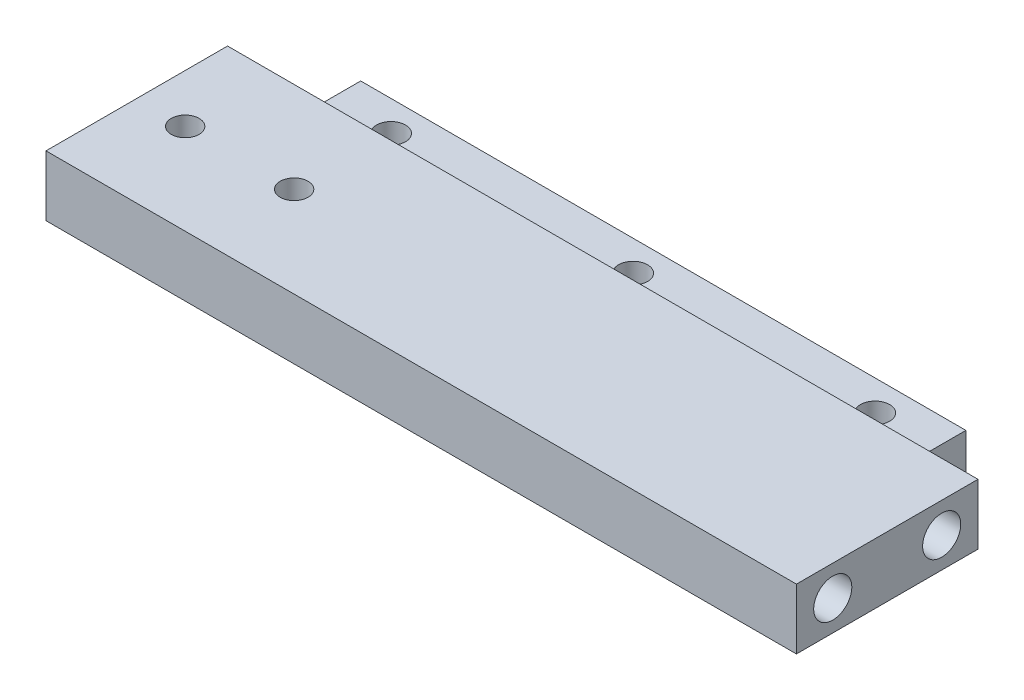
ISO-10303-21;
HEADER;
FILE_DESCRIPTION(('STEP AP214'),'2;1');
FILE_NAME('part.step','',(''),(''),'','','');
FILE_SCHEMA(('AUTOMOTIVE_DESIGN { 1 0 10303 214 1 1 1 1 }'));
ENDSEC;
DATA;
#1=APPLICATION_CONTEXT('core data for automotive mechanical design processes');
#2=APPLICATION_PROTOCOL_DEFINITION('international standard','automotive_design',2000,#1);
#3=PRODUCT_CONTEXT('',#1,'mechanical');
#4=PRODUCT('Part','Part','',(#3));
#5=PRODUCT_RELATED_PRODUCT_CATEGORY('part','',(#4));
#6=PRODUCT_DEFINITION_FORMATION('','',#4);
#7=PRODUCT_DEFINITION_CONTEXT('part definition',#1,'design');
#8=PRODUCT_DEFINITION('design','',#6,#7);
#9=PRODUCT_DEFINITION_SHAPE('','',#8);
#10=(LENGTH_UNIT() NAMED_UNIT(*) SI_UNIT(.MILLI.,.METRE.));
#11=(NAMED_UNIT(*) PLANE_ANGLE_UNIT() SI_UNIT($,.RADIAN.));
#12=(NAMED_UNIT(*) SI_UNIT($,.STERADIAN.) SOLID_ANGLE_UNIT());
#13=UNCERTAINTY_MEASURE_WITH_UNIT(LENGTH_MEASURE(1.E-05),#10,'distance_accuracy_value','');
#14=(GEOMETRIC_REPRESENTATION_CONTEXT(3) GLOBAL_UNCERTAINTY_ASSIGNED_CONTEXT((#13)) GLOBAL_UNIT_ASSIGNED_CONTEXT((#10,
#11,#12)) REPRESENTATION_CONTEXT('',''));
#15=CARTESIAN_POINT('',(0.,0.,0.));
#16=DIRECTION('',(0.,0.,1.));
#17=DIRECTION('',(1.,0.,0.));
#18=AXIS2_PLACEMENT_3D('',#15,#16,#17);
#19=CARTESIAN_POINT('',(0.,5.,-15.));
#20=DIRECTION('',(0.,0.,1.));
#21=DIRECTION('',(1.,0.,0.));
#22=AXIS2_PLACEMENT_3D('',#19,#20,#21);
#23=PLANE('',#22);
#24=DIRECTION('',(0.,1.,0.));
#25=VECTOR('',#24,1.);
#26=CARTESIAN_POINT('',(6.,3.,-15.));
#27=LINE('',#26,#25);
#28=CARTESIAN_POINT('',(6.,0.,-15.));
#29=VERTEX_POINT('',#28);
#30=CARTESIAN_POINT('',(6.,3.,-15.));
#31=VERTEX_POINT('',#30);
#32=EDGE_CURVE('E63',#29,#31,#27,.T.);
#33=ORIENTED_EDGE('',*,*,#32,.F.);
#34=DIRECTION('',(-1.,0.,0.));
#35=VECTOR('',#34,1.);
#36=CARTESIAN_POINT('',(0.,0.,-15.));
#37=LINE('',#36,#35);
#38=CARTESIAN_POINT('',(0.,0.,-15.));
#39=VERTEX_POINT('',#38);
#40=EDGE_CURVE('E199',#29,#39,#37,.T.);
#41=ORIENTED_EDGE('',*,*,#40,.T.);
#42=DIRECTION('',(0.,-1.,0.));
#43=VECTOR('',#42,1.);
#44=CARTESIAN_POINT('',(0.,5.,-15.));
#45=LINE('',#44,#43);
#46=CARTESIAN_POINT('',(0.,5.,-15.));
#47=VERTEX_POINT('',#46);
#48=EDGE_CURVE('E192',#47,#39,#45,.T.);
#49=ORIENTED_EDGE('',*,*,#48,.F.);
#50=DIRECTION('',(-1.,0.,0.));
#51=VECTOR('',#50,1.);
#52=CARTESIAN_POINT('',(0.,5.,-15.));
#53=LINE('',#52,#51);
#54=CARTESIAN_POINT('',(62.,5.,-15.));
#55=VERTEX_POINT('',#54);
#56=EDGE_CURVE('E190',#55,#47,#53,.T.);
#57=ORIENTED_EDGE('',*,*,#56,.F.);
#58=DIRECTION('',(0.,-1.,0.));
#59=VECTOR('',#58,1.);
#60=CARTESIAN_POINT('',(62.,5.,-15.));
#61=LINE('',#60,#59);
#62=CARTESIAN_POINT('',(62.,0.,-15.));
#63=VERTEX_POINT('',#62);
#64=EDGE_CURVE('E203',#55,#63,#61,.T.);
#65=ORIENTED_EDGE('',*,*,#64,.T.);
#66=CARTESIAN_POINT('',(56.,0.,-15.));
#67=VERTEX_POINT('',#66);
#68=EDGE_CURVE('E186',#63,#67,#37,.T.);
#69=ORIENTED_EDGE('',*,*,#68,.T.);
#70=DIRECTION('',(0.,-1.,0.));
#71=VECTOR('',#70,1.);
#72=CARTESIAN_POINT('',(56.,3.,-15.));
#73=LINE('',#72,#71);
#74=CARTESIAN_POINT('',(56.,3.,-15.));
#75=VERTEX_POINT('',#74);
#76=EDGE_CURVE('E137',#75,#67,#73,.T.);
#77=ORIENTED_EDGE('',*,*,#76,.F.);
#78=DIRECTION('',(1.,0.,0.));
#79=VECTOR('',#78,1.);
#80=CARTESIAN_POINT('',(56.,3.,-15.));
#81=LINE('',#80,#79);
#82=EDGE_CURVE('E58',#31,#75,#81,.T.);
#83=ORIENTED_EDGE('',*,*,#82,.F.);
#84=EDGE_LOOP('',(#33,#41,#49,#57,#65,#69,#77,#83));
#85=FACE_BOUND('',#84,.T.);
#86=ADVANCED_FACE('F41',(#85),#23,.F.);
#87=CARTESIAN_POINT('',(0.,5.,0.));
#88=DIRECTION('',(1.,0.,0.));
#89=DIRECTION('',(0.,0.,-1.));
#90=AXIS2_PLACEMENT_3D('',#87,#88,#89);
#91=PLANE('',#90);
#92=CARTESIAN_POINT('',(0.,2.5,-12.));
#93=DIRECTION('',(-1.,0.,0.));
#94=DIRECTION('',(0.,0.,1.));
#95=AXIS2_PLACEMENT_3D('',#92,#93,#94);
#96=CIRCLE('',#95,1.57499999999999);
#97=CARTESIAN_POINT('',(0.,2.5,-10.425));
#98=VERTEX_POINT('',#97);
#99=EDGE_CURVE('E169',#98,#98,#96,.T.);
#100=ORIENTED_EDGE('',*,*,#99,.F.);
#101=EDGE_LOOP('',(#100));
#102=FACE_BOUND('',#101,.T.);
#103=CARTESIAN_POINT('',(0.,2.5,-3.));
#104=DIRECTION('',(-1.,0.,0.));
#105=DIRECTION('',(0.,0.,1.));
#106=AXIS2_PLACEMENT_3D('',#103,#104,#105);
#107=CIRCLE('',#106,1.57499999999999);
#108=CARTESIAN_POINT('',(0.,2.5,-1.42500000000001));
#109=VERTEX_POINT('',#108);
#110=EDGE_CURVE('E175',#109,#109,#107,.T.);
#111=ORIENTED_EDGE('',*,*,#110,.F.);
#112=EDGE_LOOP('',(#111));
#113=FACE_BOUND('',#112,.T.);
#114=DIRECTION('',(0.,0.,1.));
#115=VECTOR('',#114,1.);
#116=CARTESIAN_POINT('',(0.,0.,0.));
#117=LINE('',#116,#115);
#118=CARTESIAN_POINT('',(0.,0.,0.));
#119=VERTEX_POINT('',#118);
#120=EDGE_CURVE('E181',#39,#119,#117,.T.);
#121=ORIENTED_EDGE('',*,*,#120,.T.);
#122=DIRECTION('',(0.,-1.,0.));
#123=VECTOR('',#122,1.);
#124=CARTESIAN_POINT('',(0.,5.,0.));
#125=LINE('',#124,#123);
#126=CARTESIAN_POINT('',(0.,5.,0.));
#127=VERTEX_POINT('',#126);
#128=EDGE_CURVE('E11',#127,#119,#125,.T.);
#129=ORIENTED_EDGE('',*,*,#128,.F.);
#130=DIRECTION('',(0.,0.,1.));
#131=VECTOR('',#130,1.);
#132=CARTESIAN_POINT('',(0.,5.,0.));
#133=LINE('',#132,#131);
#134=EDGE_CURVE('E182',#47,#127,#133,.T.);
#135=ORIENTED_EDGE('',*,*,#134,.F.);
#136=ORIENTED_EDGE('',*,*,#48,.T.);
#137=EDGE_LOOP('',(#121,#129,#135,#136));
#138=FACE_BOUND('',#137,.T.);
#139=ADVANCED_FACE('F43',(#102,#113,#138),#91,.F.);
#140=CARTESIAN_POINT('',(0.,5.,0.));
#141=DIRECTION('',(0.,0.,-1.));
#142=DIRECTION('',(-1.,0.,0.));
#143=AXIS2_PLACEMENT_3D('',#140,#141,#142);
#144=PLANE('',#143);
#145=DIRECTION('',(1.,0.,0.));
#146=VECTOR('',#145,1.);
#147=CARTESIAN_POINT('',(0.,0.,0.));
#148=LINE('',#147,#146);
#149=CARTESIAN_POINT('',(62.,0.,0.));
#150=VERTEX_POINT('',#149);
#151=EDGE_CURVE('E195',#119,#150,#148,.T.);
#152=ORIENTED_EDGE('',*,*,#151,.T.);
#153=DIRECTION('',(0.,-1.,0.));
#154=VECTOR('',#153,1.);
#155=CARTESIAN_POINT('',(62.,5.,0.));
#156=LINE('',#155,#154);
#157=CARTESIAN_POINT('',(62.,5.,0.));
#158=VERTEX_POINT('',#157);
#159=EDGE_CURVE('E50',#158,#150,#156,.T.);
#160=ORIENTED_EDGE('',*,*,#159,.F.);
#161=DIRECTION('',(1.,0.,0.));
#162=VECTOR('',#161,1.);
#163=CARTESIAN_POINT('',(0.,5.,0.));
#164=LINE('',#163,#162);
#165=EDGE_CURVE('E185',#127,#158,#164,.T.);
#166=ORIENTED_EDGE('',*,*,#165,.F.);
#167=ORIENTED_EDGE('',*,*,#128,.T.);
#168=EDGE_LOOP('',(#152,#160,#166,#167));
#169=FACE_BOUND('',#168,.T.);
#170=ADVANCED_FACE('F255',(#169),#144,.F.);
#171=CARTESIAN_POINT('',(62.,5.,0.));
#172=DIRECTION('',(-1.,0.,0.));
#173=DIRECTION('',(0.,0.,1.));
#174=AXIS2_PLACEMENT_3D('',#171,#172,#173);
#175=PLANE('',#174);
#176=CARTESIAN_POINT('',(62.,2.5,-3.));
#177=DIRECTION('',(1.,0.,0.));
#178=DIRECTION('',(0.,0.,-1.));
#179=AXIS2_PLACEMENT_3D('',#176,#177,#178);
#180=CIRCLE('',#179,1.57499999999999);
#181=CARTESIAN_POINT('',(62.,2.5,-4.57499999999999));
#182=VERTEX_POINT('',#181);
#183=EDGE_CURVE('E157',#182,#182,#180,.T.);
#184=ORIENTED_EDGE('',*,*,#183,.F.);
#185=EDGE_LOOP('',(#184));
#186=FACE_BOUND('',#185,.T.);
#187=CARTESIAN_POINT('',(62.,2.5,-12.));
#188=DIRECTION('',(1.,0.,0.));
#189=DIRECTION('',(0.,0.,-1.));
#190=AXIS2_PLACEMENT_3D('',#187,#188,#189);
#191=CIRCLE('',#190,1.57499999999999);
#192=CARTESIAN_POINT('',(62.,2.5,-13.575));
#193=VERTEX_POINT('',#192);
#194=EDGE_CURVE('E163',#193,#193,#191,.T.);
#195=ORIENTED_EDGE('',*,*,#194,.F.);
#196=EDGE_LOOP('',(#195));
#197=FACE_BOUND('',#196,.T.);
#198=DIRECTION('',(0.,0.,-1.));
#199=VECTOR('',#198,1.);
#200=CARTESIAN_POINT('',(62.,0.,0.));
#201=LINE('',#200,#199);
#202=EDGE_CURVE('E197',#150,#63,#201,.T.);
#203=ORIENTED_EDGE('',*,*,#202,.T.);
#204=ORIENTED_EDGE('',*,*,#64,.F.);
#205=DIRECTION('',(0.,0.,-1.));
#206=VECTOR('',#205,1.);
#207=CARTESIAN_POINT('',(62.,5.,0.));
#208=LINE('',#207,#206);
#209=EDGE_CURVE('E188',#158,#55,#208,.T.);
#210=ORIENTED_EDGE('',*,*,#209,.F.);
#211=ORIENTED_EDGE('',*,*,#159,.T.);
#212=EDGE_LOOP('',(#203,#204,#210,#211));
#213=FACE_BOUND('',#212,.T.);
#214=ADVANCED_FACE('F251',(#186,#197,#213),#175,.F.);
#215=CARTESIAN_POINT('',(0.,5.,0.));
#216=DIRECTION('',(0.,-1.,0.));
#217=DIRECTION('',(0.,0.,-1.));
#218=AXIS2_PLACEMENT_3D('',#215,#216,#217);
#219=PLANE('',#218);
#220=CARTESIAN_POINT('',(4.,5.,-7.5));
#221=DIRECTION('',(0.,-1.,0.));
#222=DIRECTION('',(0.,0.,-1.));
#223=AXIS2_PLACEMENT_3D('',#220,#221,#222);
#224=CIRCLE('',#223,1.15);
#225=CARTESIAN_POINT('',(4.,5.,-8.65));
#226=VERTEX_POINT('',#225);
#227=EDGE_CURVE('E143',#226,#226,#224,.T.);
#228=ORIENTED_EDGE('',*,*,#227,.T.);
#229=EDGE_LOOP('',(#228));
#230=FACE_BOUND('',#229,.T.);
#231=CARTESIAN_POINT('',(13.,5.,-7.5));
#232=DIRECTION('',(0.,-1.,0.));
#233=DIRECTION('',(0.,0.,-1.));
#234=AXIS2_PLACEMENT_3D('',#231,#232,#233);
#235=CIRCLE('',#234,1.15);
#236=CARTESIAN_POINT('',(13.,5.,-8.65));
#237=VERTEX_POINT('',#236);
#238=EDGE_CURVE('E154',#237,#237,#235,.T.);
#239=ORIENTED_EDGE('',*,*,#238,.T.);
#240=EDGE_LOOP('',(#239));
#241=FACE_BOUND('',#240,.T.);
#242=ORIENTED_EDGE('',*,*,#134,.T.);
#243=ORIENTED_EDGE('',*,*,#165,.T.);
#244=ORIENTED_EDGE('',*,*,#209,.T.);
#245=ORIENTED_EDGE('',*,*,#56,.T.);
#246=EDGE_LOOP('',(#242,#243,#244,#245));
#247=FACE_BOUND('',#246,.T.);
#248=ADVANCED_FACE('F259',(#230,#241,#247),#219,.F.);
#249=CARTESIAN_POINT('',(0.,0.,0.));
#250=DIRECTION('',(0.,-1.,0.));
#251=DIRECTION('',(0.,0.,-1.));
#252=AXIS2_PLACEMENT_3D('',#249,#250,#251);
#253=PLANE('',#252);
#254=CARTESIAN_POINT('',(51.,0.,-17.5));
#255=DIRECTION('',(0.,-1.,0.));
#256=DIRECTION('',(0.,0.,-1.));
#257=AXIS2_PLACEMENT_3D('',#254,#255,#256);
#258=CIRCLE('',#257,2.2);
#259=CARTESIAN_POINT('',(51.,0.,-19.7));
#260=VERTEX_POINT('',#259);
#261=EDGE_CURVE('E642',#260,#260,#258,.T.);
#262=ORIENTED_EDGE('',*,*,#261,.F.);
#263=EDGE_LOOP('',(#262));
#264=FACE_BOUND('',#263,.T.);
#265=CARTESIAN_POINT('',(31.,0.,-17.5));
#266=DIRECTION('',(0.,-1.,0.));
#267=DIRECTION('',(0.,0.,-1.));
#268=AXIS2_PLACEMENT_3D('',#265,#266,#267);
#269=CIRCLE('',#268,2.2);
#270=CARTESIAN_POINT('',(31.,0.,-19.7));
#271=VERTEX_POINT('',#270);
#272=EDGE_CURVE('E220',#271,#271,#269,.T.);
#273=ORIENTED_EDGE('',*,*,#272,.F.);
#274=EDGE_LOOP('',(#273));
#275=FACE_BOUND('',#274,.T.);
#276=CARTESIAN_POINT('',(11.,0.,-17.5));
#277=DIRECTION('',(0.,-1.,0.));
#278=DIRECTION('',(0.,0.,-1.));
#279=AXIS2_PLACEMENT_3D('',#276,#277,#278);
#280=CIRCLE('',#279,2.2);
#281=CARTESIAN_POINT('',(11.,0.,-19.7));
#282=VERTEX_POINT('',#281);
#283=EDGE_CURVE('E213',#282,#282,#280,.T.);
#284=ORIENTED_EDGE('',*,*,#283,.F.);
#285=EDGE_LOOP('',(#284));
#286=FACE_BOUND('',#285,.T.);
#287=CARTESIAN_POINT('',(4.,0.,-7.5));
#288=DIRECTION('',(0.,-1.,0.));
#289=DIRECTION('',(0.,0.,-1.));
#290=AXIS2_PLACEMENT_3D('',#287,#288,#289);
#291=CIRCLE('',#290,1.15);
#292=CARTESIAN_POINT('',(4.,0.,-8.65));
#293=VERTEX_POINT('',#292);
#294=EDGE_CURVE('E140',#293,#293,#291,.T.);
#295=ORIENTED_EDGE('',*,*,#294,.F.);
#296=EDGE_LOOP('',(#295));
#297=FACE_BOUND('',#296,.T.);
#298=CARTESIAN_POINT('',(13.,0.,-7.5));
#299=DIRECTION('',(0.,-1.,0.));
#300=DIRECTION('',(0.,0.,-1.));
#301=AXIS2_PLACEMENT_3D('',#298,#299,#300);
#302=CIRCLE('',#301,1.15);
#303=CARTESIAN_POINT('',(13.,0.,-8.65));
#304=VERTEX_POINT('',#303);
#305=EDGE_CURVE('E151',#304,#304,#302,.T.);
#306=ORIENTED_EDGE('',*,*,#305,.F.);
#307=EDGE_LOOP('',(#306));
#308=FACE_BOUND('',#307,.T.);
#309=ORIENTED_EDGE('',*,*,#120,.F.);
#310=ORIENTED_EDGE('',*,*,#40,.F.);
#311=DIRECTION('',(0.,0.,1.));
#312=VECTOR('',#311,1.);
#313=CARTESIAN_POINT('',(6.,0.,-20.));
#314=LINE('',#313,#312);
#315=CARTESIAN_POINT('',(6.,0.,-20.));
#316=VERTEX_POINT('',#315);
#317=EDGE_CURVE('E232',#316,#29,#314,.T.);
#318=ORIENTED_EDGE('',*,*,#317,.F.);
#319=DIRECTION('',(-1.,0.,0.));
#320=VECTOR('',#319,1.);
#321=CARTESIAN_POINT('',(56.,0.,-20.));
#322=LINE('',#321,#320);
#323=CARTESIAN_POINT('',(56.,0.,-20.));
#324=VERTEX_POINT('',#323);
#325=EDGE_CURVE('E133',#324,#316,#322,.T.);
#326=ORIENTED_EDGE('',*,*,#325,.F.);
#327=DIRECTION('',(0.,0.,1.));
#328=VECTOR('',#327,1.);
#329=CARTESIAN_POINT('',(56.,0.,-20.));
#330=LINE('',#329,#328);
#331=EDGE_CURVE('E145',#324,#67,#330,.T.);
#332=ORIENTED_EDGE('',*,*,#331,.T.);
#333=ORIENTED_EDGE('',*,*,#68,.F.);
#334=ORIENTED_EDGE('',*,*,#202,.F.);
#335=ORIENTED_EDGE('',*,*,#151,.F.);
#336=EDGE_LOOP('',(#309,#310,#318,#326,#332,#333,#334,#335));
#337=FACE_BOUND('',#336,.T.);
#338=ADVANCED_FACE('F242',(#264,#275,#286,#297,#308,#337),#253,.T.);
#339=CARTESIAN_POINT('',(10.,2.5,-3.));
#340=DIRECTION('',(-1.,0.,0.));
#341=DIRECTION('',(0.,0.,1.));
#342=AXIS2_PLACEMENT_3D('',#339,#340,#341);
#343=CONICAL_SURFACE('',#342,1.575,1.02974425867665);
#344=CARTESIAN_POINT('',(10.9463554749684,2.5,-3.));
#345=VERTEX_POINT('',#344);
#346=VERTEX_LOOP('',#345);
#347=FACE_BOUND('',#346,.T.);
#348=CARTESIAN_POINT('',(10.,2.5,-3.));
#349=DIRECTION('',(-1.,0.,0.));
#350=DIRECTION('',(0.,0.,1.));
#351=AXIS2_PLACEMENT_3D('',#348,#349,#350);
#352=CIRCLE('',#351,1.575);
#353=CARTESIAN_POINT('',(10.,2.5,-1.425));
#354=VERTEX_POINT('',#353);
#355=EDGE_CURVE('E178',#354,#354,#352,.T.);
#356=ORIENTED_EDGE('',*,*,#355,.T.);
#357=EDGE_LOOP('',(#356));
#358=FACE_BOUND('',#357,.T.);
#359=ADVANCED_FACE('F267',(#347,#358),#343,.F.);
#360=CARTESIAN_POINT('',(0.,2.5,-3.));
#361=DIRECTION('',(-1.,0.,0.));
#362=DIRECTION('',(0.,0.,1.));
#363=AXIS2_PLACEMENT_3D('',#360,#361,#362);
#364=CYLINDRICAL_SURFACE('',#363,1.57499999999999);
#365=ORIENTED_EDGE('',*,*,#355,.F.);
#366=EDGE_LOOP('',(#365));
#367=FACE_BOUND('',#366,.T.);
#368=ORIENTED_EDGE('',*,*,#110,.T.);
#369=EDGE_LOOP('',(#368));
#370=FACE_BOUND('',#369,.T.);
#371=ADVANCED_FACE('F533',(#367,#370),#364,.F.);
#372=CARTESIAN_POINT('',(10.,2.5,-12.));
#373=DIRECTION('',(-1.,0.,0.));
#374=DIRECTION('',(0.,0.,1.));
#375=AXIS2_PLACEMENT_3D('',#372,#373,#374);
#376=CONICAL_SURFACE('',#375,1.575,1.02974425867665);
#377=CARTESIAN_POINT('',(10.9463554749684,2.5,-12.));
#378=VERTEX_POINT('',#377);
#379=VERTEX_LOOP('',#378);
#380=FACE_BOUND('',#379,.T.);
#381=CARTESIAN_POINT('',(10.,2.5,-12.));
#382=DIRECTION('',(-1.,0.,0.));
#383=DIRECTION('',(0.,0.,1.));
#384=AXIS2_PLACEMENT_3D('',#381,#382,#383);
#385=CIRCLE('',#384,1.575);
#386=CARTESIAN_POINT('',(10.,2.5,-10.425));
#387=VERTEX_POINT('',#386);
#388=EDGE_CURVE('E172',#387,#387,#385,.T.);
#389=ORIENTED_EDGE('',*,*,#388,.T.);
#390=EDGE_LOOP('',(#389));
#391=FACE_BOUND('',#390,.T.);
#392=ADVANCED_FACE('F523',(#380,#391),#376,.F.);
#393=CARTESIAN_POINT('',(0.,2.5,-12.));
#394=DIRECTION('',(-1.,0.,0.));
#395=DIRECTION('',(0.,0.,1.));
#396=AXIS2_PLACEMENT_3D('',#393,#394,#395);
#397=CYLINDRICAL_SURFACE('',#396,1.57499999999999);
#398=ORIENTED_EDGE('',*,*,#388,.F.);
#399=EDGE_LOOP('',(#398));
#400=FACE_BOUND('',#399,.T.);
#401=ORIENTED_EDGE('',*,*,#99,.T.);
#402=EDGE_LOOP('',(#401));
#403=FACE_BOUND('',#402,.T.);
#404=ADVANCED_FACE('F513',(#400,#403),#397,.F.);
#405=CARTESIAN_POINT('',(54.5,2.5,-12.));
#406=DIRECTION('',(1.,0.,0.));
#407=DIRECTION('',(0.,0.,-1.));
#408=AXIS2_PLACEMENT_3D('',#405,#406,#407);
#409=CONICAL_SURFACE('',#408,1.575,1.02974425867665);
#410=CARTESIAN_POINT('',(53.5536445250316,2.5,-12.));
#411=VERTEX_POINT('',#410);
#412=VERTEX_LOOP('',#411);
#413=FACE_BOUND('',#412,.T.);
#414=CARTESIAN_POINT('',(54.5,2.5,-12.));
#415=DIRECTION('',(1.,0.,0.));
#416=DIRECTION('',(0.,0.,-1.));
#417=AXIS2_PLACEMENT_3D('',#414,#415,#416);
#418=CIRCLE('',#417,1.575);
#419=CARTESIAN_POINT('',(54.5,2.5,-13.575));
#420=VERTEX_POINT('',#419);
#421=EDGE_CURVE('E166',#420,#420,#418,.T.);
#422=ORIENTED_EDGE('',*,*,#421,.T.);
#423=EDGE_LOOP('',(#422));
#424=FACE_BOUND('',#423,.T.);
#425=ADVANCED_FACE('F305',(#413,#424),#409,.F.);
#426=CARTESIAN_POINT('',(62.,2.5,-12.));
#427=DIRECTION('',(1.,0.,0.));
#428=DIRECTION('',(0.,0.,-1.));
#429=AXIS2_PLACEMENT_3D('',#426,#427,#428);
#430=CYLINDRICAL_SURFACE('',#429,1.57499999999999);
#431=ORIENTED_EDGE('',*,*,#421,.F.);
#432=EDGE_LOOP('',(#431));
#433=FACE_BOUND('',#432,.T.);
#434=ORIENTED_EDGE('',*,*,#194,.T.);
#435=EDGE_LOOP('',(#434));
#436=FACE_BOUND('',#435,.T.);
#437=ADVANCED_FACE('F301',(#433,#436),#430,.F.);
#438=CARTESIAN_POINT('',(54.5,2.5,-3.));
#439=DIRECTION('',(1.,0.,0.));
#440=DIRECTION('',(0.,0.,-1.));
#441=AXIS2_PLACEMENT_3D('',#438,#439,#440);
#442=CONICAL_SURFACE('',#441,1.575,1.02974425867665);
#443=CARTESIAN_POINT('',(53.5536445250316,2.5,-3.));
#444=VERTEX_POINT('',#443);
#445=VERTEX_LOOP('',#444);
#446=FACE_BOUND('',#445,.T.);
#447=CARTESIAN_POINT('',(54.5,2.5,-3.));
#448=DIRECTION('',(1.,0.,0.));
#449=DIRECTION('',(0.,0.,-1.));
#450=AXIS2_PLACEMENT_3D('',#447,#448,#449);
#451=CIRCLE('',#450,1.575);
#452=CARTESIAN_POINT('',(54.5,2.5,-4.575));
#453=VERTEX_POINT('',#452);
#454=EDGE_CURVE('E160',#453,#453,#451,.T.);
#455=ORIENTED_EDGE('',*,*,#454,.T.);
#456=EDGE_LOOP('',(#455));
#457=FACE_BOUND('',#456,.T.);
#458=ADVANCED_FACE('F304',(#446,#457),#442,.F.);
#459=CARTESIAN_POINT('',(62.,2.5,-3.));
#460=DIRECTION('',(1.,0.,0.));
#461=DIRECTION('',(0.,0.,-1.));
#462=AXIS2_PLACEMENT_3D('',#459,#460,#461);
#463=CYLINDRICAL_SURFACE('',#462,1.57499999999999);
#464=ORIENTED_EDGE('',*,*,#454,.F.);
#465=EDGE_LOOP('',(#464));
#466=FACE_BOUND('',#465,.T.);
#467=ORIENTED_EDGE('',*,*,#183,.T.);
#468=EDGE_LOOP('',(#467));
#469=FACE_BOUND('',#468,.T.);
#470=ADVANCED_FACE('F297',(#466,#469),#463,.F.);
#471=CARTESIAN_POINT('',(13.,0.,-7.5));
#472=DIRECTION('',(0.,-1.,0.));
#473=DIRECTION('',(0.,0.,-1.));
#474=AXIS2_PLACEMENT_3D('',#471,#472,#473);
#475=CYLINDRICAL_SURFACE('',#474,1.15);
#476=ORIENTED_EDGE('',*,*,#238,.F.);
#477=EDGE_LOOP('',(#476));
#478=FACE_BOUND('',#477,.T.);
#479=ORIENTED_EDGE('',*,*,#305,.T.);
#480=EDGE_LOOP('',(#479));
#481=FACE_BOUND('',#480,.T.);
#482=ADVANCED_FACE('F317',(#478,#481),#475,.F.);
#483=CARTESIAN_POINT('',(4.,0.,-7.5));
#484=DIRECTION('',(0.,-1.,0.));
#485=DIRECTION('',(0.,0.,-1.));
#486=AXIS2_PLACEMENT_3D('',#483,#484,#485);
#487=CYLINDRICAL_SURFACE('',#486,1.15);
#488=ORIENTED_EDGE('',*,*,#227,.F.);
#489=EDGE_LOOP('',(#488));
#490=FACE_BOUND('',#489,.T.);
#491=ORIENTED_EDGE('',*,*,#294,.T.);
#492=EDGE_LOOP('',(#491));
#493=FACE_BOUND('',#492,.T.);
#494=ADVANCED_FACE('F346',(#490,#493),#487,.F.);
#495=CARTESIAN_POINT('',(6.,3.,-20.));
#496=DIRECTION('',(1.,0.,0.));
#497=DIRECTION('',(0.,0.,-1.));
#498=AXIS2_PLACEMENT_3D('',#495,#496,#497);
#499=PLANE('',#498);
#500=ORIENTED_EDGE('',*,*,#32,.T.);
#501=DIRECTION('',(0.,0.,1.));
#502=VECTOR('',#501,1.);
#503=CARTESIAN_POINT('',(6.,3.,-20.));
#504=LINE('',#503,#502);
#505=CARTESIAN_POINT('',(6.,3.,-20.));
#506=VERTEX_POINT('',#505);
#507=EDGE_CURVE('E122',#506,#31,#504,.T.);
#508=ORIENTED_EDGE('',*,*,#507,.F.);
#509=DIRECTION('',(0.,1.,0.));
#510=VECTOR('',#509,1.);
#511=CARTESIAN_POINT('',(6.,3.,-20.));
#512=LINE('',#511,#510);
#513=EDGE_CURVE('E128',#316,#506,#512,.T.);
#514=ORIENTED_EDGE('',*,*,#513,.F.);
#515=ORIENTED_EDGE('',*,*,#317,.T.);
#516=EDGE_LOOP('',(#500,#508,#514,#515));
#517=FACE_BOUND('',#516,.T.);
#518=ADVANCED_FACE('F139',(#517),#499,.F.);
#519=CARTESIAN_POINT('',(56.,3.,-20.));
#520=DIRECTION('',(0.,-1.,0.));
#521=DIRECTION('',(0.,0.,-1.));
#522=AXIS2_PLACEMENT_3D('',#519,#520,#521);
#523=PLANE('',#522);
#524=CARTESIAN_POINT('',(51.,3.,-17.5));
#525=DIRECTION('',(0.,-1.,0.));
#526=DIRECTION('',(0.,0.,-1.));
#527=AXIS2_PLACEMENT_3D('',#524,#525,#526);
#528=CIRCLE('',#527,1.2);
#529=CARTESIAN_POINT('',(51.,3.,-18.7));
#530=VERTEX_POINT('',#529);
#531=EDGE_CURVE('E45',#530,#530,#528,.T.);
#532=ORIENTED_EDGE('',*,*,#531,.T.);
#533=EDGE_LOOP('',(#532));
#534=FACE_BOUND('',#533,.T.);
#535=CARTESIAN_POINT('',(31.,3.,-17.5));
#536=DIRECTION('',(0.,-1.,0.));
#537=DIRECTION('',(0.,0.,-1.));
#538=AXIS2_PLACEMENT_3D('',#535,#536,#537);
#539=CIRCLE('',#538,1.2);
#540=CARTESIAN_POINT('',(31.,3.,-18.7));
#541=VERTEX_POINT('',#540);
#542=EDGE_CURVE('E211',#541,#541,#539,.T.);
#543=ORIENTED_EDGE('',*,*,#542,.T.);
#544=EDGE_LOOP('',(#543));
#545=FACE_BOUND('',#544,.T.);
#546=CARTESIAN_POINT('',(11.,3.,-17.5));
#547=DIRECTION('',(0.,-1.,0.));
#548=DIRECTION('',(0.,0.,-1.));
#549=AXIS2_PLACEMENT_3D('',#546,#547,#548);
#550=CIRCLE('',#549,1.2);
#551=CARTESIAN_POINT('',(11.,3.,-18.7));
#552=VERTEX_POINT('',#551);
#553=EDGE_CURVE('E208',#552,#552,#550,.T.);
#554=ORIENTED_EDGE('',*,*,#553,.T.);
#555=EDGE_LOOP('',(#554));
#556=FACE_BOUND('',#555,.T.);
#557=ORIENTED_EDGE('',*,*,#82,.T.);
#558=DIRECTION('',(0.,0.,1.));
#559=VECTOR('',#558,1.);
#560=CARTESIAN_POINT('',(56.,3.,-20.));
#561=LINE('',#560,#559);
#562=CARTESIAN_POINT('',(56.,3.,-20.));
#563=VERTEX_POINT('',#562);
#564=EDGE_CURVE('E124',#563,#75,#561,.T.);
#565=ORIENTED_EDGE('',*,*,#564,.F.);
#566=DIRECTION('',(1.,0.,0.));
#567=VECTOR('',#566,1.);
#568=CARTESIAN_POINT('',(56.,3.,-20.));
#569=LINE('',#568,#567);
#570=EDGE_CURVE('E118',#506,#563,#569,.T.);
#571=ORIENTED_EDGE('',*,*,#570,.F.);
#572=ORIENTED_EDGE('',*,*,#507,.T.);
#573=EDGE_LOOP('',(#557,#565,#571,#572));
#574=FACE_BOUND('',#573,.T.);
#575=ADVANCED_FACE('F120',(#534,#545,#556,#574),#523,.F.);
#576=CARTESIAN_POINT('',(56.,3.,-20.));
#577=DIRECTION('',(-1.,0.,0.));
#578=DIRECTION('',(0.,0.,1.));
#579=AXIS2_PLACEMENT_3D('',#576,#577,#578);
#580=PLANE('',#579);
#581=ORIENTED_EDGE('',*,*,#76,.T.);
#582=ORIENTED_EDGE('',*,*,#331,.F.);
#583=DIRECTION('',(0.,-1.,0.));
#584=VECTOR('',#583,1.);
#585=CARTESIAN_POINT('',(56.,3.,-20.));
#586=LINE('',#585,#584);
#587=EDGE_CURVE('E127',#563,#324,#586,.T.);
#588=ORIENTED_EDGE('',*,*,#587,.F.);
#589=ORIENTED_EDGE('',*,*,#564,.T.);
#590=EDGE_LOOP('',(#581,#582,#588,#589));
#591=FACE_BOUND('',#590,.T.);
#592=ADVANCED_FACE('F245',(#591),#580,.F.);
#593=CARTESIAN_POINT('',(0.,0.,-20.));
#594=DIRECTION('',(0.,0.,-1.));
#595=DIRECTION('',(-1.,0.,0.));
#596=AXIS2_PLACEMENT_3D('',#593,#594,#595);
#597=PLANE('',#596);
#598=ORIENTED_EDGE('',*,*,#513,.T.);
#599=ORIENTED_EDGE('',*,*,#570,.T.);
#600=ORIENTED_EDGE('',*,*,#587,.T.);
#601=ORIENTED_EDGE('',*,*,#325,.T.);
#602=EDGE_LOOP('',(#598,#599,#600,#601));
#603=FACE_BOUND('',#602,.T.);
#604=ADVANCED_FACE('F131',(#603),#597,.T.);
#605=CARTESIAN_POINT('',(11.,0.,-17.5));
#606=DIRECTION('',(0.,-1.,0.));
#607=DIRECTION('',(0.,0.,-1.));
#608=AXIS2_PLACEMENT_3D('',#605,#606,#607);
#609=CYLINDRICAL_SURFACE('',#608,1.2);
#610=CARTESIAN_POINT('',(11.,1.,-17.5));
#611=DIRECTION('',(0.,-1.,0.));
#612=DIRECTION('',(0.,0.,-1.));
#613=AXIS2_PLACEMENT_3D('',#610,#611,#612);
#614=CIRCLE('',#613,1.2);
#615=CARTESIAN_POINT('',(11.,1.,-18.7));
#616=VERTEX_POINT('',#615);
#617=EDGE_CURVE('E210',#616,#616,#614,.T.);
#618=ORIENTED_EDGE('',*,*,#617,.T.);
#619=EDGE_LOOP('',(#618));
#620=FACE_BOUND('',#619,.T.);
#621=ORIENTED_EDGE('',*,*,#553,.F.);
#622=EDGE_LOOP('',(#621));
#623=FACE_BOUND('',#622,.T.);
#624=ADVANCED_FACE('F386',(#620,#623),#609,.F.);
#625=CARTESIAN_POINT('',(11.,0.,-17.5));
#626=DIRECTION('',(0.,-1.,0.));
#627=DIRECTION('',(0.,0.,-1.));
#628=AXIS2_PLACEMENT_3D('',#625,#626,#627);
#629=CONICAL_SURFACE('',#628,2.2,0.785398163397448);
#630=ORIENTED_EDGE('',*,*,#617,.F.);
#631=EDGE_LOOP('',(#630));
#632=FACE_BOUND('',#631,.T.);
#633=ORIENTED_EDGE('',*,*,#283,.T.);
#634=EDGE_LOOP('',(#633));
#635=FACE_BOUND('',#634,.T.);
#636=ADVANCED_FACE('F392',(#632,#635),#629,.F.);
#637=CARTESIAN_POINT('',(31.,0.,-17.5));
#638=DIRECTION('',(0.,-1.,0.));
#639=DIRECTION('',(0.,0.,-1.));
#640=AXIS2_PLACEMENT_3D('',#637,#638,#639);
#641=CYLINDRICAL_SURFACE('',#640,1.2);
#642=CARTESIAN_POINT('',(31.,1.,-17.5));
#643=DIRECTION('',(0.,-1.,0.));
#644=DIRECTION('',(0.,0.,-1.));
#645=AXIS2_PLACEMENT_3D('',#642,#643,#644);
#646=CIRCLE('',#645,1.2);
#647=CARTESIAN_POINT('',(31.,1.,-18.7));
#648=VERTEX_POINT('',#647);
#649=EDGE_CURVE('E214',#648,#648,#646,.T.);
#650=ORIENTED_EDGE('',*,*,#649,.T.);
#651=EDGE_LOOP('',(#650));
#652=FACE_BOUND('',#651,.T.);
#653=ORIENTED_EDGE('',*,*,#542,.F.);
#654=EDGE_LOOP('',(#653));
#655=FACE_BOUND('',#654,.T.);
#656=ADVANCED_FACE('F400',(#652,#655),#641,.F.);
#657=CARTESIAN_POINT('',(31.,0.,-17.5));
#658=DIRECTION('',(0.,-1.,0.));
#659=DIRECTION('',(0.,0.,-1.));
#660=AXIS2_PLACEMENT_3D('',#657,#658,#659);
#661=CONICAL_SURFACE('',#660,2.2,0.785398163397448);
#662=ORIENTED_EDGE('',*,*,#649,.F.);
#663=EDGE_LOOP('',(#662));
#664=FACE_BOUND('',#663,.T.);
#665=ORIENTED_EDGE('',*,*,#272,.T.);
#666=EDGE_LOOP('',(#665));
#667=FACE_BOUND('',#666,.T.);
#668=ADVANCED_FACE('F408',(#664,#667),#661,.F.);
#669=CARTESIAN_POINT('',(51.,0.,-17.5));
#670=DIRECTION('',(0.,-1.,0.));
#671=DIRECTION('',(0.,0.,-1.));
#672=AXIS2_PLACEMENT_3D('',#669,#670,#671);
#673=CYLINDRICAL_SURFACE('',#672,1.2);
#674=CARTESIAN_POINT('',(51.,1.,-17.5));
#675=DIRECTION('',(0.,-1.,0.));
#676=DIRECTION('',(0.,0.,-1.));
#677=AXIS2_PLACEMENT_3D('',#674,#675,#676);
#678=CIRCLE('',#677,1.2);
#679=CARTESIAN_POINT('',(51.,1.,-18.7));
#680=VERTEX_POINT('',#679);
#681=EDGE_CURVE('E639',#680,#680,#678,.T.);
#682=ORIENTED_EDGE('',*,*,#681,.T.);
#683=EDGE_LOOP('',(#682));
#684=FACE_BOUND('',#683,.T.);
#685=ORIENTED_EDGE('',*,*,#531,.F.);
#686=EDGE_LOOP('',(#685));
#687=FACE_BOUND('',#686,.T.);
#688=ADVANCED_FACE('F415',(#684,#687),#673,.F.);
#689=CARTESIAN_POINT('',(51.,0.,-17.5));
#690=DIRECTION('',(0.,-1.,0.));
#691=DIRECTION('',(0.,0.,-1.));
#692=AXIS2_PLACEMENT_3D('',#689,#690,#691);
#693=CONICAL_SURFACE('',#692,2.2,0.785398163397448);
#694=ORIENTED_EDGE('',*,*,#681,.F.);
#695=EDGE_LOOP('',(#694));
#696=FACE_BOUND('',#695,.T.);
#697=ORIENTED_EDGE('',*,*,#261,.T.);
#698=EDGE_LOOP('',(#697));
#699=FACE_BOUND('',#698,.T.);
#700=ADVANCED_FACE('F423',(#696,#699),#693,.F.);
#701=CLOSED_SHELL('',(#86,#139,#170,#214,#248,#338,#359,#371,#392,#404,#425,#437,#458,#470,#482,
#494,#518,#575,#592,#604,#624,#636,#656,#668,#688,#700));
#702=MANIFOLD_SOLID_BREP('B2',#701);
#703=ADVANCED_BREP_SHAPE_REPRESENTATION('',(#18,#702),#14);
#704=SHAPE_DEFINITION_REPRESENTATION(#9,#703);
ENDSEC;
END-ISO-10303-21;
